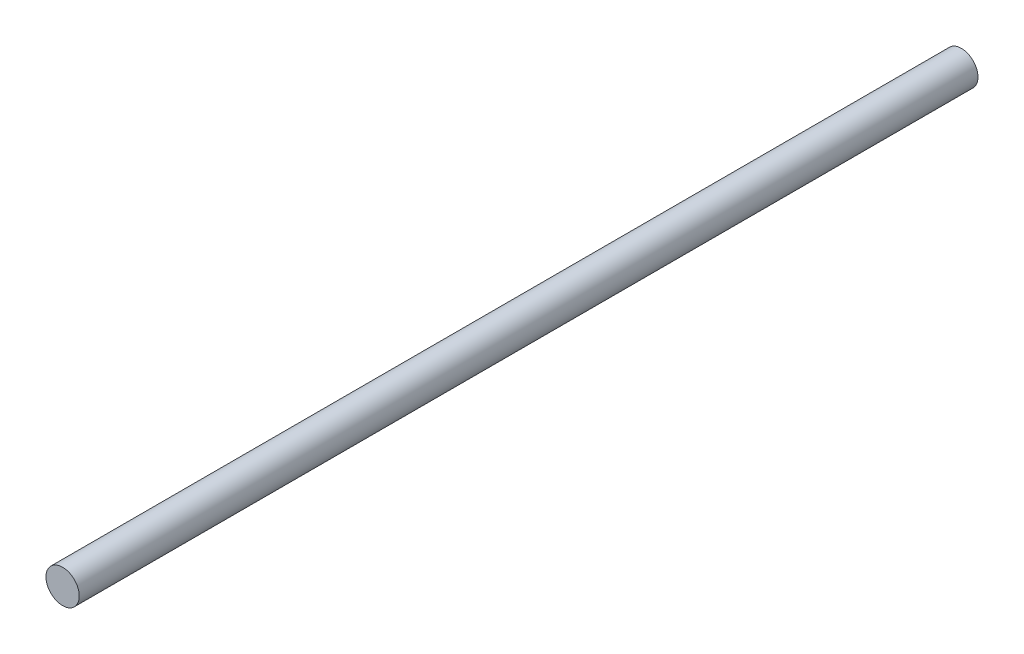
ISO-10303-21;
HEADER;
FILE_DESCRIPTION(('STEP AP214'),'2;1');
FILE_NAME('part.step','',(''),(''),'','','');
FILE_SCHEMA(('AUTOMOTIVE_DESIGN { 1 0 10303 214 1 1 1 1 }'));
ENDSEC;
DATA;
#1=APPLICATION_CONTEXT('core data for automotive mechanical design processes');
#2=APPLICATION_PROTOCOL_DEFINITION('international standard','automotive_design',2000,#1);
#3=PRODUCT_CONTEXT('',#1,'mechanical');
#4=PRODUCT('Part','Part','',(#3));
#5=PRODUCT_RELATED_PRODUCT_CATEGORY('part','',(#4));
#6=PRODUCT_DEFINITION_FORMATION('','',#4);
#7=PRODUCT_DEFINITION_CONTEXT('part definition',#1,'design');
#8=PRODUCT_DEFINITION('design','',#6,#7);
#9=PRODUCT_DEFINITION_SHAPE('','',#8);
#10=(LENGTH_UNIT() NAMED_UNIT(*) SI_UNIT(.MILLI.,.METRE.));
#11=(NAMED_UNIT(*) PLANE_ANGLE_UNIT() SI_UNIT($,.RADIAN.));
#12=(NAMED_UNIT(*) SI_UNIT($,.STERADIAN.) SOLID_ANGLE_UNIT());
#13=UNCERTAINTY_MEASURE_WITH_UNIT(LENGTH_MEASURE(1.E-05),#10,'distance_accuracy_value','');
#14=(GEOMETRIC_REPRESENTATION_CONTEXT(3) GLOBAL_UNCERTAINTY_ASSIGNED_CONTEXT((#13)) GLOBAL_UNIT_ASSIGNED_CONTEXT((#10,
#11,#12)) REPRESENTATION_CONTEXT('',''));
#15=CARTESIAN_POINT('',(0.,0.,0.));
#16=DIRECTION('',(0.,0.,1.));
#17=DIRECTION('',(1.,0.,0.));
#18=AXIS2_PLACEMENT_3D('',#15,#16,#17);
#19=CARTESIAN_POINT('',(0.,0.,162.));
#20=DIRECTION('',(0.,0.,-1.));
#21=DIRECTION('',(-1.,0.,0.));
#22=AXIS2_PLACEMENT_3D('',#19,#20,#21);
#23=CYLINDRICAL_SURFACE('',#22,3.);
#24=CARTESIAN_POINT('',(0.,0.,162.));
#25=DIRECTION('',(0.,0.,1.));
#26=DIRECTION('',(1.,0.,0.));
#27=AXIS2_PLACEMENT_3D('',#24,#25,#26);
#28=CIRCLE('',#27,3.);
#29=CARTESIAN_POINT('',(3.,0.,162.));
#30=VERTEX_POINT('',#29);
#31=EDGE_CURVE('E10',#30,#30,#28,.T.);
#32=ORIENTED_EDGE('',*,*,#31,.F.);
#33=EDGE_LOOP('',(#32));
#34=FACE_BOUND('',#33,.T.);
#35=CARTESIAN_POINT('',(0.,0.,0.));
#36=DIRECTION('',(0.,0.,1.));
#37=DIRECTION('',(1.,0.,0.));
#38=AXIS2_PLACEMENT_3D('',#35,#36,#37);
#39=CIRCLE('',#38,3.);
#40=CARTESIAN_POINT('',(3.,0.,0.));
#41=VERTEX_POINT('',#40);
#42=EDGE_CURVE('E36',#41,#41,#39,.T.);
#43=ORIENTED_EDGE('',*,*,#42,.T.);
#44=EDGE_LOOP('',(#43));
#45=FACE_BOUND('',#44,.T.);
#46=ADVANCED_FACE('F33',(#34,#45),#23,.T.);
#47=CARTESIAN_POINT('',(0.,0.,162.));
#48=DIRECTION('',(0.,0.,1.));
#49=DIRECTION('',(1.,0.,0.));
#50=AXIS2_PLACEMENT_3D('',#47,#48,#49);
#51=PLANE('',#50);
#52=ORIENTED_EDGE('',*,*,#31,.T.);
#53=EDGE_LOOP('',(#52));
#54=FACE_BOUND('',#53,.T.);
#55=ADVANCED_FACE('F48',(#54),#51,.T.);
#56=CARTESIAN_POINT('',(0.,0.,0.));
#57=DIRECTION('',(0.,0.,1.));
#58=DIRECTION('',(1.,0.,0.));
#59=AXIS2_PLACEMENT_3D('',#56,#57,#58);
#60=PLANE('',#59);
#61=ORIENTED_EDGE('',*,*,#42,.F.);
#62=EDGE_LOOP('',(#61));
#63=FACE_BOUND('',#62,.T.);
#64=ADVANCED_FACE('F46',(#63),#60,.F.);
#65=CLOSED_SHELL('',(#46,#55,#64));
#66=MANIFOLD_SOLID_BREP('B2',#65);
#67=ADVANCED_BREP_SHAPE_REPRESENTATION('',(#18,#66),#14);
#68=SHAPE_DEFINITION_REPRESENTATION(#9,#67);
ENDSEC;
END-ISO-10303-21;
